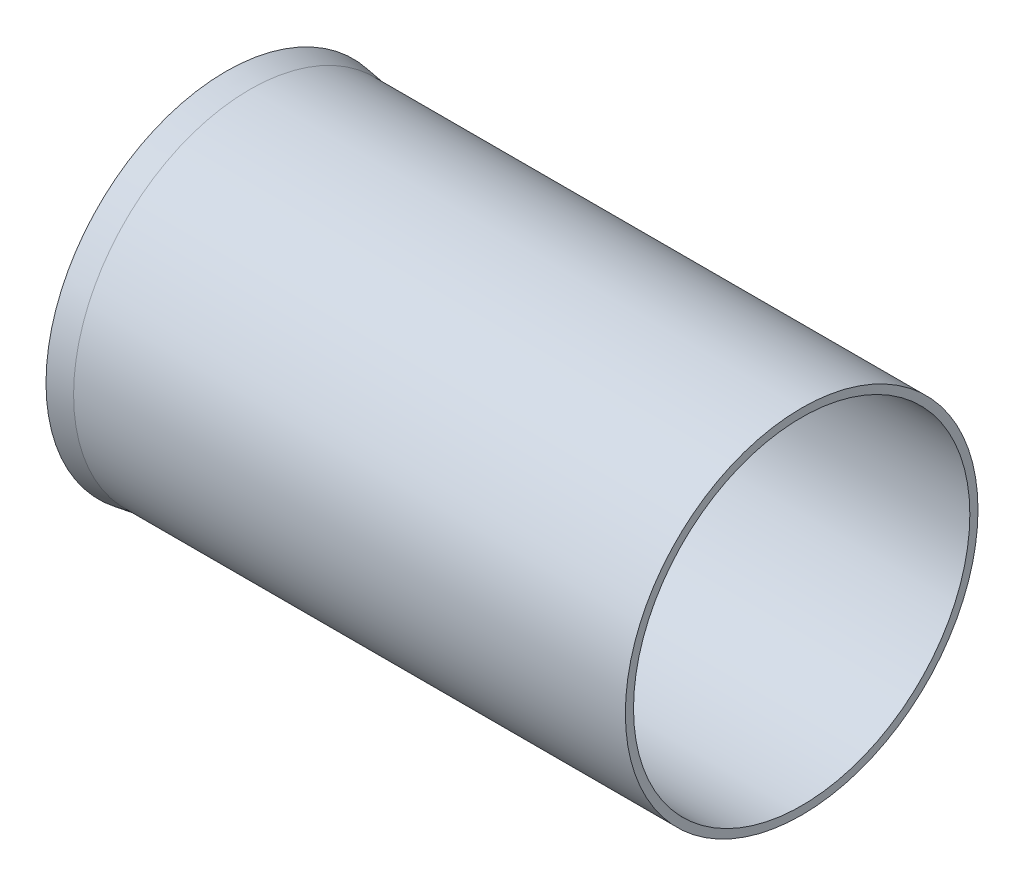
ISO-10303-21;
HEADER;
FILE_DESCRIPTION(('STEP AP214'),'2;1');
FILE_NAME('part.step','',(''),(''),'','','');
FILE_SCHEMA(('AUTOMOTIVE_DESIGN { 1 0 10303 214 1 1 1 1 }'));
ENDSEC;
DATA;
#1=APPLICATION_CONTEXT('core data for automotive mechanical design processes');
#2=APPLICATION_PROTOCOL_DEFINITION('international standard','automotive_design',2000,#1);
#3=PRODUCT_CONTEXT('',#1,'mechanical');
#4=PRODUCT('Part','Part','',(#3));
#5=PRODUCT_RELATED_PRODUCT_CATEGORY('part','',(#4));
#6=PRODUCT_DEFINITION_FORMATION('','',#4);
#7=PRODUCT_DEFINITION_CONTEXT('part definition',#1,'design');
#8=PRODUCT_DEFINITION('design','',#6,#7);
#9=PRODUCT_DEFINITION_SHAPE('','',#8);
#10=(LENGTH_UNIT() NAMED_UNIT(*) SI_UNIT(.MILLI.,.METRE.));
#11=(NAMED_UNIT(*) PLANE_ANGLE_UNIT() SI_UNIT($,.RADIAN.));
#12=(NAMED_UNIT(*) SI_UNIT($,.STERADIAN.) SOLID_ANGLE_UNIT());
#13=UNCERTAINTY_MEASURE_WITH_UNIT(LENGTH_MEASURE(1.E-05),#10,'distance_accuracy_value','');
#14=(GEOMETRIC_REPRESENTATION_CONTEXT(3) GLOBAL_UNCERTAINTY_ASSIGNED_CONTEXT((#13)) GLOBAL_UNIT_ASSIGNED_CONTEXT((#10,
#11,#12)) REPRESENTATION_CONTEXT('',''));
#15=CARTESIAN_POINT('',(0.,0.,0.));
#16=DIRECTION('',(0.,0.,1.));
#17=DIRECTION('',(1.,0.,0.));
#18=AXIS2_PLACEMENT_3D('',#15,#16,#17);
#19=CARTESIAN_POINT('',(0.,0.,0.));
#20=DIRECTION('',(1.,0.,0.));
#21=DIRECTION('',(0.,0.,-1.));
#22=AXIS2_PLACEMENT_3D('',#19,#20,#21);
#23=CONICAL_SURFACE('',#22,3.75,1.4219063791854);
#24=CARTESIAN_POINT('',(-0.0252178769981415,0.,0.));
#25=DIRECTION('',(-1.,0.,0.));
#26=DIRECTION('',(0.,0.,1.));
#27=AXIS2_PLACEMENT_3D('',#24,#25,#26);
#28=CIRCLE('',#27,3.58188082001239);
#29=CARTESIAN_POINT('',(-0.0252178769981415,0.,3.58188082001239));
#30=VERTEX_POINT('',#29);
#31=EDGE_CURVE('E52',#30,#30,#28,.T.);
#32=ORIENTED_EDGE('',*,*,#31,.F.);
#33=EDGE_LOOP('',(#32));
#34=FACE_BOUND('',#33,.T.);
#35=CARTESIAN_POINT('',(0.,0.,0.));
#36=DIRECTION('',(-1.,0.,0.));
#37=DIRECTION('',(0.,0.,1.));
#38=AXIS2_PLACEMENT_3D('',#35,#36,#37);
#39=CIRCLE('',#38,3.75);
#40=CARTESIAN_POINT('',(0.,0.,3.75));
#41=VERTEX_POINT('',#40);
#42=EDGE_CURVE('E10',#41,#41,#39,.T.);
#43=ORIENTED_EDGE('',*,*,#42,.T.);
#44=EDGE_LOOP('',(#43));
#45=FACE_BOUND('',#44,.T.);
#46=ADVANCED_FACE('F30',(#34,#45),#23,.T.);
#47=CARTESIAN_POINT('',(0.5,0.,0.));
#48=DIRECTION('',(-1.,0.,0.));
#49=DIRECTION('',(0.,0.,1.));
#50=AXIS2_PLACEMENT_3D('',#47,#48,#49);
#51=CONICAL_SURFACE('',#50,3.675,0.148889947609497);
#52=ORIENTED_EDGE('',*,*,#42,.F.);
#53=EDGE_LOOP('',(#52));
#54=FACE_BOUND('',#53,.T.);
#55=CARTESIAN_POINT('',(0.5,0.,0.));
#56=DIRECTION('',(-1.,0.,0.));
#57=DIRECTION('',(0.,0.,1.));
#58=AXIS2_PLACEMENT_3D('',#55,#56,#57);
#59=CIRCLE('',#58,3.675);
#60=CARTESIAN_POINT('',(0.5,0.,3.675));
#61=VERTEX_POINT('',#60);
#62=EDGE_CURVE('E36',#61,#61,#59,.T.);
#63=ORIENTED_EDGE('',*,*,#62,.T.);
#64=EDGE_LOOP('',(#63));
#65=FACE_BOUND('',#64,.T.);
#66=ADVANCED_FACE('F59',(#54,#65),#51,.T.);
#67=CARTESIAN_POINT('',(0.,0.,0.));
#68=DIRECTION('',(-1.,0.,0.));
#69=DIRECTION('',(0.,0.,1.));
#70=AXIS2_PLACEMENT_3D('',#67,#68,#69);
#71=CYLINDRICAL_SURFACE('',#70,3.675);
#72=ORIENTED_EDGE('',*,*,#62,.F.);
#73=EDGE_LOOP('',(#72));
#74=FACE_BOUND('',#73,.T.);
#75=CARTESIAN_POINT('',(12.,0.,0.));
#76=DIRECTION('',(-1.,0.,0.));
#77=DIRECTION('',(0.,0.,1.));
#78=AXIS2_PLACEMENT_3D('',#75,#76,#77);
#79=CIRCLE('',#78,3.675);
#80=CARTESIAN_POINT('',(12.,0.,3.675));
#81=VERTEX_POINT('',#80);
#82=EDGE_CURVE('E40',#81,#81,#79,.T.);
#83=ORIENTED_EDGE('',*,*,#82,.T.);
#84=EDGE_LOOP('',(#83));
#85=FACE_BOUND('',#84,.T.);
#86=ADVANCED_FACE('F63',(#74,#85),#71,.T.);
#87=CARTESIAN_POINT('',(12.,3.675,0.));
#88=DIRECTION('',(-1.,0.,0.));
#89=DIRECTION('',(0.,0.,1.));
#90=AXIS2_PLACEMENT_3D('',#87,#88,#89);
#91=PLANE('',#90);
#92=ORIENTED_EDGE('',*,*,#82,.F.);
#93=EDGE_LOOP('',(#92));
#94=FACE_BOUND('',#93,.T.);
#95=CARTESIAN_POINT('',(12.,0.,0.));
#96=DIRECTION('',(-1.,0.,0.));
#97=DIRECTION('',(0.,0.,1.));
#98=AXIS2_PLACEMENT_3D('',#95,#96,#97);
#99=CIRCLE('',#98,3.505);
#100=CARTESIAN_POINT('',(12.,0.,3.505));
#101=VERTEX_POINT('',#100);
#102=EDGE_CURVE('E44',#101,#101,#99,.T.);
#103=ORIENTED_EDGE('',*,*,#102,.T.);
#104=EDGE_LOOP('',(#103));
#105=FACE_BOUND('',#104,.T.);
#106=ADVANCED_FACE('F68',(#94,#105),#91,.F.);
#107=CARTESIAN_POINT('',(0.,0.,0.));
#108=DIRECTION('',(-1.,0.,0.));
#109=DIRECTION('',(0.,0.,1.));
#110=AXIS2_PLACEMENT_3D('',#107,#108,#109);
#111=CYLINDRICAL_SURFACE('',#110,3.505);
#112=ORIENTED_EDGE('',*,*,#102,.F.);
#113=EDGE_LOOP('',(#112));
#114=FACE_BOUND('',#113,.T.);
#115=CARTESIAN_POINT('',(0.487320923084455,0.,0.));
#116=DIRECTION('',(-1.,0.,0.));
#117=DIRECTION('',(0.,0.,1.));
#118=AXIS2_PLACEMENT_3D('',#115,#116,#117);
#119=CIRCLE('',#118,3.505);
#120=CARTESIAN_POINT('',(0.487320923084455,0.,3.505));
#121=VERTEX_POINT('',#120);
#122=EDGE_CURVE('E49',#121,#121,#119,.T.);
#123=ORIENTED_EDGE('',*,*,#122,.T.);
#124=EDGE_LOOP('',(#123));
#125=FACE_BOUND('',#124,.T.);
#126=ADVANCED_FACE('F74',(#114,#125),#111,.F.);
#127=CARTESIAN_POINT('',(-0.0252178769981415,0.,0.));
#128=DIRECTION('',(-1.,0.,0.));
#129=DIRECTION('',(0.,0.,1.));
#130=AXIS2_PLACEMENT_3D('',#127,#128,#129);
#131=CONICAL_SURFACE('',#130,3.58188082001239,0.148889947609497);
#132=ORIENTED_EDGE('',*,*,#122,.F.);
#133=EDGE_LOOP('',(#132));
#134=FACE_BOUND('',#133,.T.);
#135=ORIENTED_EDGE('',*,*,#31,.T.);
#136=EDGE_LOOP('',(#135));
#137=FACE_BOUND('',#136,.T.);
#138=ADVANCED_FACE('F56',(#134,#137),#131,.F.);
#139=CLOSED_SHELL('',(#46,#66,#86,#106,#126,#138));
#140=MANIFOLD_SOLID_BREP('B2',#139);
#141=ADVANCED_BREP_SHAPE_REPRESENTATION('',(#18,#140),#14);
#142=SHAPE_DEFINITION_REPRESENTATION(#9,#141);
ENDSEC;
END-ISO-10303-21;
